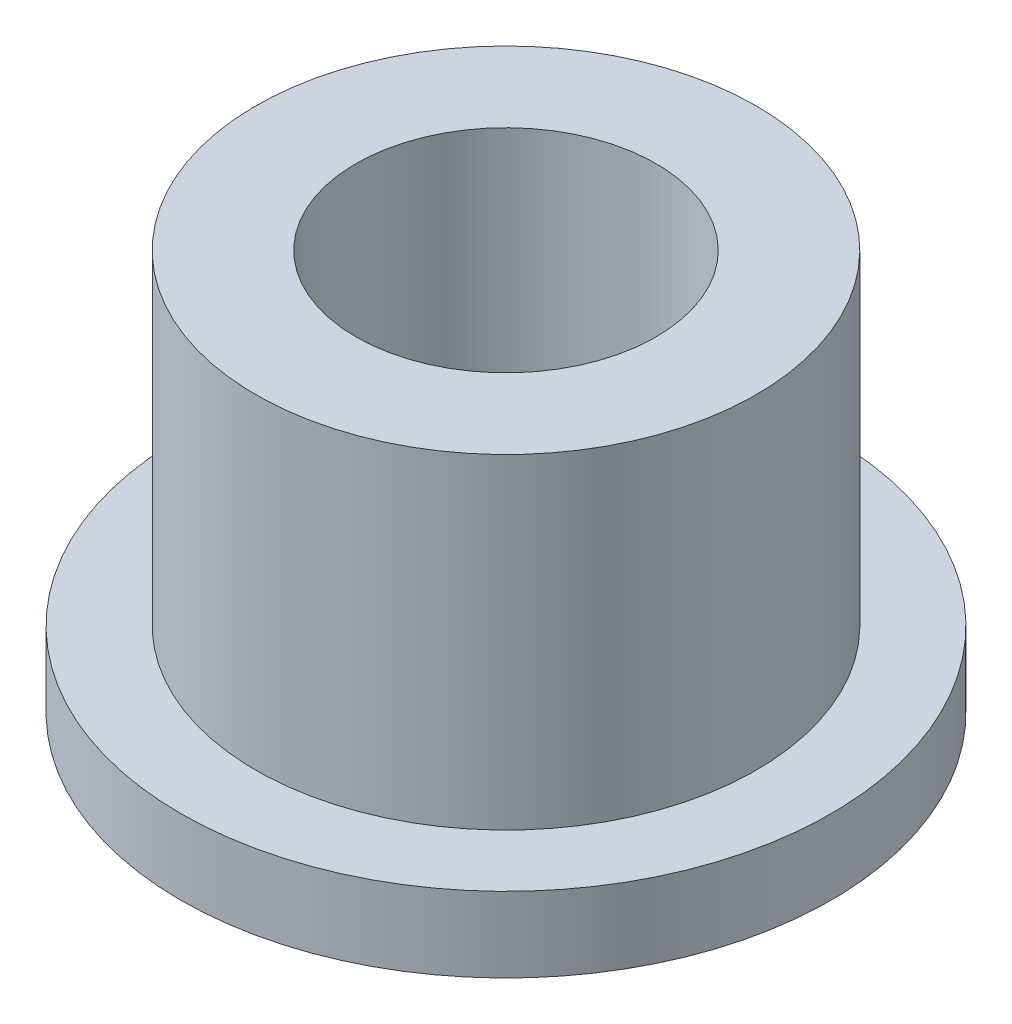
ISO-10303-21;
HEADER;
FILE_DESCRIPTION(('STEP AP214'),'2;1');
FILE_NAME('part.step','',(''),(''),'','','');
FILE_SCHEMA(('AUTOMOTIVE_DESIGN { 1 0 10303 214 1 1 1 1 }'));
ENDSEC;
DATA;
#1=APPLICATION_CONTEXT('core data for automotive mechanical design processes');
#2=APPLICATION_PROTOCOL_DEFINITION('international standard','automotive_design',2000,#1);
#3=PRODUCT_CONTEXT('',#1,'mechanical');
#4=PRODUCT('Part','Part','',(#3));
#5=PRODUCT_RELATED_PRODUCT_CATEGORY('part','',(#4));
#6=PRODUCT_DEFINITION_FORMATION('','',#4);
#7=PRODUCT_DEFINITION_CONTEXT('part definition',#1,'design');
#8=PRODUCT_DEFINITION('design','',#6,#7);
#9=PRODUCT_DEFINITION_SHAPE('','',#8);
#10=(LENGTH_UNIT() NAMED_UNIT(*) SI_UNIT(.MILLI.,.METRE.));
#11=(NAMED_UNIT(*) PLANE_ANGLE_UNIT() SI_UNIT($,.RADIAN.));
#12=(NAMED_UNIT(*) SI_UNIT($,.STERADIAN.) SOLID_ANGLE_UNIT());
#13=UNCERTAINTY_MEASURE_WITH_UNIT(LENGTH_MEASURE(1.E-05),#10,'distance_accuracy_value','');
#14=(GEOMETRIC_REPRESENTATION_CONTEXT(3) GLOBAL_UNCERTAINTY_ASSIGNED_CONTEXT((#13)) GLOBAL_UNIT_ASSIGNED_CONTEXT((#10,
#11,#12)) REPRESENTATION_CONTEXT('',''));
#15=CARTESIAN_POINT('',(0.,0.,0.));
#16=DIRECTION('',(0.,0.,1.));
#17=DIRECTION('',(1.,0.,0.));
#18=AXIS2_PLACEMENT_3D('',#15,#16,#17);
#19=CARTESIAN_POINT('',(0.,3.,0.));
#20=DIRECTION('',(0.,1.,0.));
#21=DIRECTION('',(0.,0.,1.));
#22=AXIS2_PLACEMENT_3D('',#19,#20,#21);
#23=PLANE('',#22);
#24=CARTESIAN_POINT('',(0.,3.,0.));
#25=DIRECTION('',(0.,1.,0.));
#26=DIRECTION('',(0.,0.,1.));
#27=AXIS2_PLACEMENT_3D('',#24,#25,#26);
#28=CIRCLE('',#27,13.);
#29=CARTESIAN_POINT('',(0.,3.,13.));
#30=VERTEX_POINT('',#29);
#31=EDGE_CURVE('E10',#30,#30,#28,.T.);
#32=ORIENTED_EDGE('',*,*,#31,.T.);
#33=EDGE_LOOP('',(#32));
#34=FACE_BOUND('',#33,.T.);
#35=CARTESIAN_POINT('',(0.,3.,0.));
#36=DIRECTION('',(0.,1.,0.));
#37=DIRECTION('',(0.,0.,1.));
#38=AXIS2_PLACEMENT_3D('',#35,#36,#37);
#39=CIRCLE('',#38,10.);
#40=CARTESIAN_POINT('',(0.,3.,-10.));
#41=VERTEX_POINT('',#40);
#42=EDGE_CURVE('E58',#41,#41,#39,.T.);
#43=ORIENTED_EDGE('',*,*,#42,.F.);
#44=EDGE_LOOP('',(#43));
#45=FACE_BOUND('',#44,.T.);
#46=ADVANCED_FACE('F38',(#34,#45),#23,.T.);
#47=CARTESIAN_POINT('',(0.,0.,0.));
#48=DIRECTION('',(0.,1.,0.));
#49=DIRECTION('',(0.,0.,1.));
#50=AXIS2_PLACEMENT_3D('',#47,#48,#49);
#51=PLANE('',#50);
#52=CARTESIAN_POINT('',(0.,0.,0.));
#53=DIRECTION('',(0.,1.,0.));
#54=DIRECTION('',(0.,0.,1.));
#55=AXIS2_PLACEMENT_3D('',#52,#53,#54);
#56=CIRCLE('',#55,13.);
#57=CARTESIAN_POINT('',(0.,0.,13.));
#58=VERTEX_POINT('',#57);
#59=EDGE_CURVE('E42',#58,#58,#56,.T.);
#60=ORIENTED_EDGE('',*,*,#59,.F.);
#61=EDGE_LOOP('',(#60));
#62=FACE_BOUND('',#61,.T.);
#63=CARTESIAN_POINT('',(0.,0.,0.));
#64=DIRECTION('',(0.,1.,0.));
#65=DIRECTION('',(0.,0.,1.));
#66=AXIS2_PLACEMENT_3D('',#63,#64,#65);
#67=CIRCLE('',#66,6.);
#68=CARTESIAN_POINT('',(0.,0.,6.));
#69=VERTEX_POINT('',#68);
#70=EDGE_CURVE('E52',#69,#69,#67,.T.);
#71=ORIENTED_EDGE('',*,*,#70,.T.);
#72=EDGE_LOOP('',(#71));
#73=FACE_BOUND('',#72,.T.);
#74=ADVANCED_FACE('F87',(#62,#73),#51,.F.);
#75=CARTESIAN_POINT('',(0.,3.,0.));
#76=DIRECTION('',(0.,-1.,0.));
#77=DIRECTION('',(0.,0.,-1.));
#78=AXIS2_PLACEMENT_3D('',#75,#76,#77);
#79=CYLINDRICAL_SURFACE('',#78,13.);
#80=ORIENTED_EDGE('',*,*,#31,.F.);
#81=EDGE_LOOP('',(#80));
#82=FACE_BOUND('',#81,.T.);
#83=ORIENTED_EDGE('',*,*,#59,.T.);
#84=EDGE_LOOP('',(#83));
#85=FACE_BOUND('',#84,.T.);
#86=ADVANCED_FACE('F40',(#82,#85),#79,.T.);
#87=CARTESIAN_POINT('',(0.,3.,0.));
#88=DIRECTION('',(0.,-1.,0.));
#89=DIRECTION('',(0.,0.,-1.));
#90=AXIS2_PLACEMENT_3D('',#87,#88,#89);
#91=CYLINDRICAL_SURFACE('',#90,6.);
#92=ORIENTED_EDGE('',*,*,#70,.F.);
#93=EDGE_LOOP('',(#92));
#94=FACE_BOUND('',#93,.T.);
#95=CARTESIAN_POINT('',(0.,16.,0.));
#96=DIRECTION('',(0.,1.,0.));
#97=DIRECTION('',(0.,0.,1.));
#98=AXIS2_PLACEMENT_3D('',#95,#96,#97);
#99=CIRCLE('',#98,6.);
#100=CARTESIAN_POINT('',(0.,16.,6.));
#101=VERTEX_POINT('',#100);
#102=EDGE_CURVE('E62',#101,#101,#99,.T.);
#103=ORIENTED_EDGE('',*,*,#102,.T.);
#104=EDGE_LOOP('',(#103));
#105=FACE_BOUND('',#104,.T.);
#106=ADVANCED_FACE('F71',(#94,#105),#91,.F.);
#107=CARTESIAN_POINT('',(0.,16.,0.));
#108=DIRECTION('',(0.,1.,0.));
#109=DIRECTION('',(0.,0.,1.));
#110=AXIS2_PLACEMENT_3D('',#107,#108,#109);
#111=PLANE('',#110);
#112=CARTESIAN_POINT('',(0.,16.,0.));
#113=DIRECTION('',(0.,1.,0.));
#114=DIRECTION('',(0.,0.,1.));
#115=AXIS2_PLACEMENT_3D('',#112,#113,#114);
#116=CIRCLE('',#115,10.);
#117=CARTESIAN_POINT('',(0.,16.,-10.));
#118=VERTEX_POINT('',#117);
#119=EDGE_CURVE('E57',#118,#118,#116,.T.);
#120=ORIENTED_EDGE('',*,*,#119,.T.);
#121=EDGE_LOOP('',(#120));
#122=FACE_BOUND('',#121,.T.);
#123=ORIENTED_EDGE('',*,*,#102,.F.);
#124=EDGE_LOOP('',(#123));
#125=FACE_BOUND('',#124,.T.);
#126=ADVANCED_FACE('F73',(#122,#125),#111,.T.);
#127=CARTESIAN_POINT('',(0.,16.,0.));
#128=DIRECTION('',(0.,-1.,0.));
#129=DIRECTION('',(0.,0.,-1.));
#130=AXIS2_PLACEMENT_3D('',#127,#128,#129);
#131=CYLINDRICAL_SURFACE('',#130,10.);
#132=CARTESIAN_POINT('',(0.,16.,-10.));
#133=CARTESIAN_POINT('',(0.,15.8645833333333,-10.));
#134=CARTESIAN_POINT('',(0.,15.7291666666667,-10.));
#135=CARTESIAN_POINT('',(0.,15.4583333333333,-10.));
#136=CARTESIAN_POINT('',(0.,15.3229166666667,-10.));
#137=CARTESIAN_POINT('',(0.,15.0520833333333,-10.));
#138=CARTESIAN_POINT('',(0.,14.9166666666667,-10.));
#139=CARTESIAN_POINT('',(0.,14.6458333333333,-10.));
#140=CARTESIAN_POINT('',(0.,14.5104166666667,-10.));
#141=CARTESIAN_POINT('',(0.,14.2395833333333,-10.));
#142=CARTESIAN_POINT('',(0.,14.1041666666667,-10.));
#143=CARTESIAN_POINT('',(0.,13.8333333333333,-10.));
#144=CARTESIAN_POINT('',(0.,13.6979166666667,-10.));
#145=CARTESIAN_POINT('',(0.,13.4270833333333,-10.));
#146=CARTESIAN_POINT('',(0.,13.2916666666667,-10.));
#147=CARTESIAN_POINT('',(0.,13.0208333333333,-10.));
#148=CARTESIAN_POINT('',(0.,12.8854166666667,-10.));
#149=CARTESIAN_POINT('',(0.,12.6145833333333,-10.));
#150=CARTESIAN_POINT('',(0.,12.4791666666667,-10.));
#151=CARTESIAN_POINT('',(0.,12.2083333333333,-10.));
#152=CARTESIAN_POINT('',(0.,12.0729166666667,-10.));
#153=CARTESIAN_POINT('',(0.,11.8020833333333,-10.));
#154=CARTESIAN_POINT('',(0.,11.6666666666667,-10.));
#155=CARTESIAN_POINT('',(0.,11.3958333333333,-10.));
#156=CARTESIAN_POINT('',(0.,11.2604166666667,-10.));
#157=CARTESIAN_POINT('',(0.,10.9895833333333,-10.));
#158=CARTESIAN_POINT('',(0.,10.8541666666667,-10.));
#159=CARTESIAN_POINT('',(0.,10.5833333333333,-10.));
#160=CARTESIAN_POINT('',(0.,10.4479166666667,-10.));
#161=CARTESIAN_POINT('',(0.,10.1770833333333,-10.));
#162=CARTESIAN_POINT('',(0.,10.0416666666667,-10.));
#163=CARTESIAN_POINT('',(0.,9.77083333333333,-10.));
#164=CARTESIAN_POINT('',(0.,9.63541666666667,-10.));
#165=CARTESIAN_POINT('',(0.,9.36458333333333,-10.));
#166=CARTESIAN_POINT('',(0.,9.22916666666667,-10.));
#167=CARTESIAN_POINT('',(0.,8.95833333333333,-10.));
#168=CARTESIAN_POINT('',(0.,8.82291666666667,-10.));
#169=CARTESIAN_POINT('',(0.,8.55208333333333,-10.));
#170=CARTESIAN_POINT('',(0.,8.41666666666667,-10.));
#171=CARTESIAN_POINT('',(0.,8.14583333333333,-10.));
#172=CARTESIAN_POINT('',(0.,8.01041666666667,-10.));
#173=CARTESIAN_POINT('',(0.,7.73958333333333,-10.));
#174=CARTESIAN_POINT('',(0.,7.60416666666667,-10.));
#175=CARTESIAN_POINT('',(0.,7.33333333333333,-10.));
#176=CARTESIAN_POINT('',(0.,7.19791666666667,-10.));
#177=CARTESIAN_POINT('',(0.,6.92708333333333,-10.));
#178=CARTESIAN_POINT('',(0.,6.79166666666667,-10.));
#179=CARTESIAN_POINT('',(0.,6.52083333333333,-10.));
#180=CARTESIAN_POINT('',(0.,6.38541666666667,-10.));
#181=CARTESIAN_POINT('',(0.,6.11458333333333,-10.));
#182=CARTESIAN_POINT('',(0.,5.97916666666667,-10.));
#183=CARTESIAN_POINT('',(0.,5.70833333333333,-10.));
#184=CARTESIAN_POINT('',(0.,5.57291666666667,-10.));
#185=CARTESIAN_POINT('',(0.,5.30208333333333,-10.));
#186=CARTESIAN_POINT('',(0.,5.16666666666667,-10.));
#187=CARTESIAN_POINT('',(0.,4.89583333333333,-10.));
#188=CARTESIAN_POINT('',(0.,4.76041666666667,-10.));
#189=CARTESIAN_POINT('',(0.,4.48958333333333,-10.));
#190=CARTESIAN_POINT('',(0.,4.35416666666667,-10.));
#191=CARTESIAN_POINT('',(0.,4.08333333333333,-10.));
#192=CARTESIAN_POINT('',(0.,3.94791666666667,-10.));
#193=CARTESIAN_POINT('',(0.,3.67708333333333,-10.));
#194=CARTESIAN_POINT('',(0.,3.54166666666667,-10.));
#195=CARTESIAN_POINT('',(0.,3.27083333333333,-10.));
#196=CARTESIAN_POINT('',(0.,3.13541666666667,-10.));
#197=CARTESIAN_POINT('',(0.,3.,-10.));
#198=B_SPLINE_CURVE_WITH_KNOTS('',3,(#132,#133,#134,#135,#136,#137,#138,#139,#140,#141,#142,
#143,#144,#145,#146,#147,#148,#149,#150,#151,#152,#153,#154,#155,#156,#157,#158,#159,#160,#161,
#162,#163,#164,#165,#166,#167,#168,#169,#170,#171,#172,#173,#174,#175,#176,#177,#178,#179,#180,
#181,#182,#183,#184,#185,#186,#187,#188,#189,#190,#191,#192,#193,#194,#195,#196,#197),
.UNSPECIFIED.,.F.,.F.,(4,2,2,2,2,2,2,2,2,2,2,2,2,2,2,2,2,2,2,2,2,2,2,2,2,2,2,2,2,2,2,2,4),(0.,
0.406249999999999,0.812499999999997,1.21875,1.625,2.03125,2.4375,2.84375,3.25,3.65625,4.0625,
4.46875,4.875,5.28125,5.6875,6.09375,6.5,6.90625,7.3125,7.71875,8.125,8.53124999999999,8.9375,
9.34375,9.75,10.15625,10.5625,10.96875,11.375,11.78125,12.1875,12.59375,13.),.UNSPECIFIED.);
#199=EDGE_CURVE('BSEAM75',#118,#41,#198,.T.);
#200=ORIENTED_EDGE('',*,*,#119,.F.);
#201=ORIENTED_EDGE('',*,*,#42,.T.);
#202=ORIENTED_EDGE('',*,*,#199,.T.);
#203=ORIENTED_EDGE('',*,*,#199,.F.);
#204=EDGE_LOOP('',(#200,#202,#201,#203));
#205=FACE_BOUND('',#204,.T.);
#206=ADVANCED_FACE('F75',(#205),#131,.T.);
#207=CLOSED_SHELL('',(#46,#74,#86,#106,#126,#206));
#208=MANIFOLD_SOLID_BREP('B2',#207);
#209=ADVANCED_BREP_SHAPE_REPRESENTATION('',(#18,#208),#14);
#210=SHAPE_DEFINITION_REPRESENTATION(#9,#209);
ENDSEC;
END-ISO-10303-21;
